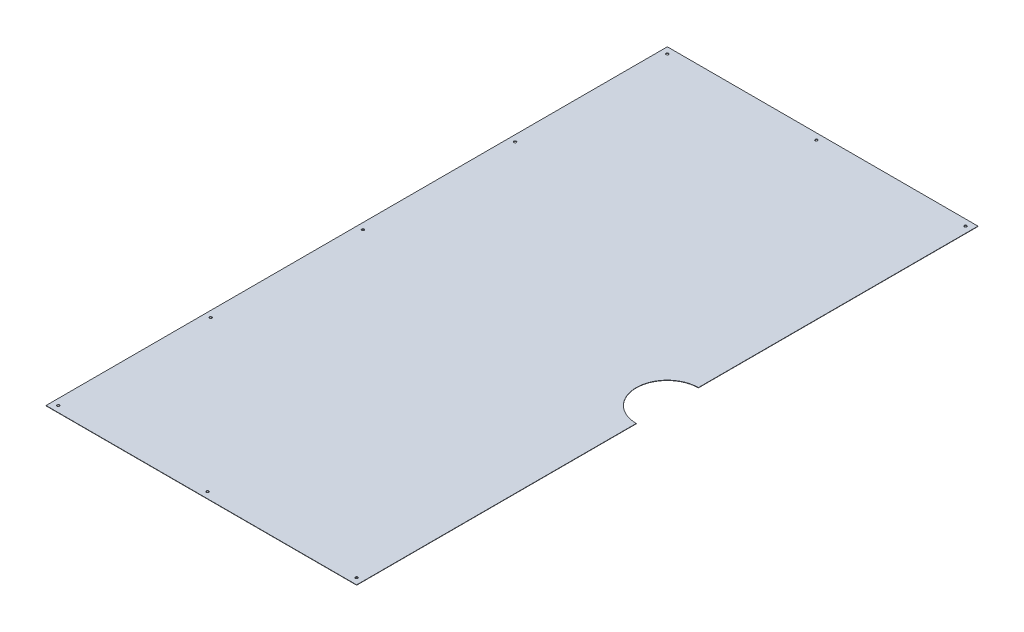
ISO-10303-21;
HEADER;
FILE_DESCRIPTION(('STEP AP214'),'2;1');
FILE_NAME('part.step','',(''),(''),'','','');
FILE_SCHEMA(('AUTOMOTIVE_DESIGN { 1 0 10303 214 1 1 1 1 }'));
ENDSEC;
DATA;
#1=APPLICATION_CONTEXT('core data for automotive mechanical design processes');
#2=APPLICATION_PROTOCOL_DEFINITION('international standard','automotive_design',2000,#1);
#3=PRODUCT_CONTEXT('',#1,'mechanical');
#4=PRODUCT('Part','Part','',(#3));
#5=PRODUCT_RELATED_PRODUCT_CATEGORY('part','',(#4));
#6=PRODUCT_DEFINITION_FORMATION('','',#4);
#7=PRODUCT_DEFINITION_CONTEXT('part definition',#1,'design');
#8=PRODUCT_DEFINITION('design','',#6,#7);
#9=PRODUCT_DEFINITION_SHAPE('','',#8);
#10=(LENGTH_UNIT() NAMED_UNIT(*) SI_UNIT(.MILLI.,.METRE.));
#11=(NAMED_UNIT(*) PLANE_ANGLE_UNIT() SI_UNIT($,.RADIAN.));
#12=(NAMED_UNIT(*) SI_UNIT($,.STERADIAN.) SOLID_ANGLE_UNIT());
#13=UNCERTAINTY_MEASURE_WITH_UNIT(LENGTH_MEASURE(1.E-05),#10,'distance_accuracy_value','');
#14=(GEOMETRIC_REPRESENTATION_CONTEXT(3) GLOBAL_UNCERTAINTY_ASSIGNED_CONTEXT((#13)) GLOBAL_UNIT_ASSIGNED_CONTEXT((#10,
#11,#12)) REPRESENTATION_CONTEXT('',''));
#15=CARTESIAN_POINT('',(0.,0.,0.));
#16=DIRECTION('',(0.,0.,1.));
#17=DIRECTION('',(1.,0.,0.));
#18=AXIS2_PLACEMENT_3D('',#15,#16,#17);
#19=CARTESIAN_POINT('',(500.,1.,0.));
#20=DIRECTION('',(0.,-1.,0.));
#21=DIRECTION('',(0.,0.,-1.));
#22=AXIS2_PLACEMENT_3D('',#19,#20,#21);
#23=CYLINDRICAL_SURFACE('',#22,100.);
#24=CARTESIAN_POINT('',(500.,0.,0.));
#25=DIRECTION('',(0.,1.,0.));
#26=DIRECTION('',(0.,0.,1.));
#27=AXIS2_PLACEMENT_3D('',#24,#25,#26);
#28=CIRCLE('',#27,100.);
#29=CARTESIAN_POINT('',(500.,0.,-100.));
#30=VERTEX_POINT('',#29);
#31=CARTESIAN_POINT('',(500.,0.,100.));
#32=VERTEX_POINT('',#31);
#33=EDGE_CURVE('E171',#30,#32,#28,.T.);
#34=ORIENTED_EDGE('',*,*,#33,.F.);
#35=DIRECTION('',(0.,-1.,0.));
#36=VECTOR('',#35,1.);
#37=CARTESIAN_POINT('',(500.,1.,-100.));
#38=LINE('',#37,#36);
#39=CARTESIAN_POINT('',(500.,1.,-100.));
#40=VERTEX_POINT('',#39);
#41=EDGE_CURVE('E93',#40,#30,#38,.T.);
#42=ORIENTED_EDGE('',*,*,#41,.F.);
#43=CARTESIAN_POINT('',(500.,1.,0.));
#44=DIRECTION('',(0.,1.,0.));
#45=DIRECTION('',(0.,0.,1.));
#46=AXIS2_PLACEMENT_3D('',#43,#44,#45);
#47=CIRCLE('',#46,100.);
#48=CARTESIAN_POINT('',(500.,1.,100.));
#49=VERTEX_POINT('',#48);
#50=EDGE_CURVE('E189',#40,#49,#47,.T.);
#51=ORIENTED_EDGE('',*,*,#50,.T.);
#52=DIRECTION('',(0.,-1.,0.));
#53=VECTOR('',#52,1.);
#54=CARTESIAN_POINT('',(500.,1.,100.));
#55=LINE('',#54,#53);
#56=EDGE_CURVE('E89',#49,#32,#55,.T.);
#57=ORIENTED_EDGE('',*,*,#56,.T.);
#58=EDGE_LOOP('',(#34,#42,#51,#57));
#59=FACE_BOUND('',#58,.T.);
#60=ADVANCED_FACE('F41',(#59),#23,.F.);
#61=CARTESIAN_POINT('',(500.,1.,-3.39234813079909E-13));
#62=DIRECTION('',(-1.,0.,0.));
#63=DIRECTION('',(0.,0.,1.));
#64=AXIS2_PLACEMENT_3D('',#61,#62,#63);
#65=PLANE('',#64);
#66=DIRECTION('',(0.,0.,-1.));
#67=VECTOR('',#66,1.);
#68=CARTESIAN_POINT('',(500.,0.,-3.39234813079909E-13));
#69=LINE('',#68,#67);
#70=CARTESIAN_POINT('',(499.999999999999,0.,-1000.));
#71=VERTEX_POINT('',#70);
#72=EDGE_CURVE('E174',#30,#71,#69,.T.);
#73=ORIENTED_EDGE('',*,*,#72,.T.);
#74=DIRECTION('',(0.,-1.,0.));
#75=VECTOR('',#74,1.);
#76=CARTESIAN_POINT('',(499.999999999999,1.,-1000.));
#77=LINE('',#76,#75);
#78=CARTESIAN_POINT('',(499.999999999999,1.,-1000.));
#79=VERTEX_POINT('',#78);
#80=EDGE_CURVE('E196',#79,#71,#77,.T.);
#81=ORIENTED_EDGE('',*,*,#80,.F.);
#82=DIRECTION('',(0.,0.,-1.));
#83=VECTOR('',#82,1.);
#84=CARTESIAN_POINT('',(500.,1.,-3.39234813079909E-13));
#85=LINE('',#84,#83);
#86=EDGE_CURVE('E129',#40,#79,#85,.T.);
#87=ORIENTED_EDGE('',*,*,#86,.F.);
#88=ORIENTED_EDGE('',*,*,#41,.T.);
#89=EDGE_LOOP('',(#73,#81,#87,#88));
#90=FACE_BOUND('',#89,.T.);
#91=ADVANCED_FACE('F254',(#90),#65,.F.);
#92=CARTESIAN_POINT('',(0.,1.,-1000.));
#93=DIRECTION('',(0.,0.,-1.));
#94=DIRECTION('',(-1.,0.,0.));
#95=AXIS2_PLACEMENT_3D('',#92,#93,#94);
#96=PLANE('',#95);
#97=DIRECTION('',(1.,0.,0.));
#98=VECTOR('',#97,1.);
#99=CARTESIAN_POINT('',(0.,0.,-1000.));
#100=LINE('',#99,#98);
#101=CARTESIAN_POINT('',(-500.,0.,-1000.));
#102=VERTEX_POINT('',#101);
#103=EDGE_CURVE('E178',#102,#71,#100,.T.);
#104=ORIENTED_EDGE('',*,*,#103,.F.);
#105=DIRECTION('',(0.,-1.,0.));
#106=VECTOR('',#105,1.);
#107=CARTESIAN_POINT('',(-500.,1.,-1000.));
#108=LINE('',#107,#106);
#109=CARTESIAN_POINT('',(-500.,1.,-1000.));
#110=VERTEX_POINT('',#109);
#111=EDGE_CURVE('E114',#110,#102,#108,.T.);
#112=ORIENTED_EDGE('',*,*,#111,.F.);
#113=DIRECTION('',(1.,0.,0.));
#114=VECTOR('',#113,1.);
#115=CARTESIAN_POINT('',(0.,1.,-1000.));
#116=LINE('',#115,#114);
#117=EDGE_CURVE('E125',#110,#79,#116,.T.);
#118=ORIENTED_EDGE('',*,*,#117,.T.);
#119=ORIENTED_EDGE('',*,*,#80,.T.);
#120=EDGE_LOOP('',(#104,#112,#118,#119));
#121=FACE_BOUND('',#120,.T.);
#122=ADVANCED_FACE('F259',(#121),#96,.T.);
#123=CARTESIAN_POINT('',(-500.,1.,0.));
#124=DIRECTION('',(-1.,0.,0.));
#125=DIRECTION('',(0.,0.,1.));
#126=AXIS2_PLACEMENT_3D('',#123,#124,#125);
#127=PLANE('',#126);
#128=DIRECTION('',(0.,0.,-1.));
#129=VECTOR('',#128,1.);
#130=CARTESIAN_POINT('',(-500.,0.,0.));
#131=LINE('',#130,#129);
#132=CARTESIAN_POINT('',(-500.,0.,1000.));
#133=VERTEX_POINT('',#132);
#134=EDGE_CURVE('E110',#133,#102,#131,.T.);
#135=ORIENTED_EDGE('',*,*,#134,.F.);
#136=DIRECTION('',(0.,-1.,0.));
#137=VECTOR('',#136,1.);
#138=CARTESIAN_POINT('',(-500.,1.,1000.));
#139=LINE('',#138,#137);
#140=CARTESIAN_POINT('',(-500.,1.,1000.));
#141=VERTEX_POINT('',#140);
#142=EDGE_CURVE('E104',#141,#133,#139,.T.);
#143=ORIENTED_EDGE('',*,*,#142,.F.);
#144=DIRECTION('',(0.,0.,-1.));
#145=VECTOR('',#144,1.);
#146=CARTESIAN_POINT('',(-500.,1.,0.));
#147=LINE('',#146,#145);
#148=EDGE_CURVE('E108',#141,#110,#147,.T.);
#149=ORIENTED_EDGE('',*,*,#148,.T.);
#150=ORIENTED_EDGE('',*,*,#111,.T.);
#151=EDGE_LOOP('',(#135,#143,#149,#150));
#152=FACE_BOUND('',#151,.T.);
#153=ADVANCED_FACE('F106',(#152),#127,.T.);
#154=CARTESIAN_POINT('',(2.22044604925031E-13,1.,1000.));
#155=DIRECTION('',(0.,0.,-1.));
#156=DIRECTION('',(-1.,0.,0.));
#157=AXIS2_PLACEMENT_3D('',#154,#155,#156);
#158=PLANE('',#157);
#159=DIRECTION('',(1.,0.,0.));
#160=VECTOR('',#159,1.);
#161=CARTESIAN_POINT('',(2.22044604925031E-13,0.,1000.));
#162=LINE('',#161,#160);
#163=CARTESIAN_POINT('',(500.,0.,1000.));
#164=VERTEX_POINT('',#163);
#165=EDGE_CURVE('E184',#133,#164,#162,.T.);
#166=ORIENTED_EDGE('',*,*,#165,.T.);
#167=DIRECTION('',(0.,-1.,0.));
#168=VECTOR('',#167,1.);
#169=CARTESIAN_POINT('',(500.,1.,1000.));
#170=LINE('',#169,#168);
#171=CARTESIAN_POINT('',(500.,1.,1000.));
#172=VERTEX_POINT('',#171);
#173=EDGE_CURVE('E115',#172,#164,#170,.T.);
#174=ORIENTED_EDGE('',*,*,#173,.F.);
#175=DIRECTION('',(1.,0.,0.));
#176=VECTOR('',#175,1.);
#177=CARTESIAN_POINT('',(2.22044604925031E-13,1.,1000.));
#178=LINE('',#177,#176);
#179=EDGE_CURVE('E118',#141,#172,#178,.T.);
#180=ORIENTED_EDGE('',*,*,#179,.F.);
#181=ORIENTED_EDGE('',*,*,#142,.T.);
#182=EDGE_LOOP('',(#166,#174,#180,#181));
#183=FACE_BOUND('',#182,.T.);
#184=ADVANCED_FACE('F119',(#183),#158,.F.);
#185=CARTESIAN_POINT('',(500.,1.,2.46716227694479E-13));
#186=DIRECTION('',(-1.,0.,0.));
#187=DIRECTION('',(0.,0.,1.));
#188=AXIS2_PLACEMENT_3D('',#185,#186,#187);
#189=PLANE('',#188);
#190=DIRECTION('',(0.,0.,-1.));
#191=VECTOR('',#190,1.);
#192=CARTESIAN_POINT('',(500.,0.,2.46716227694479E-13));
#193=LINE('',#192,#191);
#194=EDGE_CURVE('E82',#164,#32,#193,.T.);
#195=ORIENTED_EDGE('',*,*,#194,.T.);
#196=ORIENTED_EDGE('',*,*,#56,.F.);
#197=DIRECTION('',(0.,0.,-1.));
#198=VECTOR('',#197,1.);
#199=CARTESIAN_POINT('',(500.,1.,2.46716227694479E-13));
#200=LINE('',#199,#198);
#201=EDGE_CURVE('E59',#172,#49,#200,.T.);
#202=ORIENTED_EDGE('',*,*,#201,.F.);
#203=ORIENTED_EDGE('',*,*,#173,.T.);
#204=EDGE_LOOP('',(#195,#196,#202,#203));
#205=FACE_BOUND('',#204,.T.);
#206=ADVANCED_FACE('F308',(#205),#189,.F.);
#207=CARTESIAN_POINT('',(0.,1.,0.));
#208=DIRECTION('',(0.,1.,0.));
#209=DIRECTION('',(0.,0.,1.));
#210=AXIS2_PLACEMENT_3D('',#207,#208,#209);
#211=PLANE('',#210);
#212=CARTESIAN_POINT('',(0.,1.,-980.));
#213=DIRECTION('',(0.,1.,0.));
#214=DIRECTION('',(0.,0.,1.));
#215=AXIS2_PLACEMENT_3D('',#212,#213,#214);
#216=CIRCLE('',#215,4.00000000000023);
#217=CARTESIAN_POINT('',(0.,1.,-976.));
#218=VERTEX_POINT('',#217);
#219=EDGE_CURVE('E11',#218,#218,#216,.F.);
#220=ORIENTED_EDGE('',*,*,#219,.T.);
#221=EDGE_LOOP('',(#220));
#222=FACE_BOUND('',#221,.T.);
#223=CARTESIAN_POINT('',(480.,1.,-980.));
#224=DIRECTION('',(0.,1.,0.));
#225=DIRECTION('',(0.,0.,1.));
#226=AXIS2_PLACEMENT_3D('',#223,#224,#225);
#227=CIRCLE('',#226,4.00000000000023);
#228=CARTESIAN_POINT('',(480.,1.,-976.));
#229=VERTEX_POINT('',#228);
#230=EDGE_CURVE('E51',#229,#229,#227,.F.);
#231=ORIENTED_EDGE('',*,*,#230,.T.);
#232=EDGE_LOOP('',(#231));
#233=FACE_BOUND('',#232,.T.);
#234=CARTESIAN_POINT('',(-480.,1.,-980.));
#235=DIRECTION('',(0.,1.,0.));
#236=DIRECTION('',(0.,0.,1.));
#237=AXIS2_PLACEMENT_3D('',#234,#235,#236);
#238=CIRCLE('',#237,4.00000000000023);
#239=CARTESIAN_POINT('',(-480.,1.,-976.));
#240=VERTEX_POINT('',#239);
#241=EDGE_CURVE('E225',#240,#240,#238,.F.);
#242=ORIENTED_EDGE('',*,*,#241,.T.);
#243=EDGE_LOOP('',(#242));
#244=FACE_BOUND('',#243,.T.);
#245=CARTESIAN_POINT('',(-480.,1.,-490.));
#246=DIRECTION('',(0.,1.,0.));
#247=DIRECTION('',(0.,0.,1.));
#248=AXIS2_PLACEMENT_3D('',#245,#246,#247);
#249=CIRCLE('',#248,4.00000000000023);
#250=CARTESIAN_POINT('',(-480.,1.,-486.));
#251=VERTEX_POINT('',#250);
#252=EDGE_CURVE('E221',#251,#251,#249,.F.);
#253=ORIENTED_EDGE('',*,*,#252,.T.);
#254=EDGE_LOOP('',(#253));
#255=FACE_BOUND('',#254,.T.);
#256=CARTESIAN_POINT('',(-480.,1.,1.11022302462516E-13));
#257=DIRECTION('',(0.,1.,0.));
#258=DIRECTION('',(0.,0.,1.));
#259=AXIS2_PLACEMENT_3D('',#256,#257,#258);
#260=CIRCLE('',#259,4.00000000000023);
#261=CARTESIAN_POINT('',(-480.,1.,4.00000000000034));
#262=VERTEX_POINT('',#261);
#263=EDGE_CURVE('E217',#262,#262,#260,.F.);
#264=ORIENTED_EDGE('',*,*,#263,.T.);
#265=EDGE_LOOP('',(#264));
#266=FACE_BOUND('',#265,.T.);
#267=CARTESIAN_POINT('',(-480.,1.,490.));
#268=DIRECTION('',(0.,1.,0.));
#269=DIRECTION('',(0.,0.,1.));
#270=AXIS2_PLACEMENT_3D('',#267,#268,#269);
#271=CIRCLE('',#270,4.00000000000023);
#272=CARTESIAN_POINT('',(-480.,1.,494.));
#273=VERTEX_POINT('',#272);
#274=EDGE_CURVE('E213',#273,#273,#271,.F.);
#275=ORIENTED_EDGE('',*,*,#274,.T.);
#276=EDGE_LOOP('',(#275));
#277=FACE_BOUND('',#276,.T.);
#278=CARTESIAN_POINT('',(-480.,1.,980.));
#279=DIRECTION('',(0.,1.,0.));
#280=DIRECTION('',(0.,0.,1.));
#281=AXIS2_PLACEMENT_3D('',#278,#279,#280);
#282=CIRCLE('',#281,4.00000000000023);
#283=CARTESIAN_POINT('',(-480.,1.,984.));
#284=VERTEX_POINT('',#283);
#285=EDGE_CURVE('E209',#284,#284,#282,.F.);
#286=ORIENTED_EDGE('',*,*,#285,.T.);
#287=EDGE_LOOP('',(#286));
#288=FACE_BOUND('',#287,.T.);
#289=CARTESIAN_POINT('',(-2.22044604925031E-13,1.,980.));
#290=DIRECTION('',(0.,1.,0.));
#291=DIRECTION('',(0.,0.,1.));
#292=AXIS2_PLACEMENT_3D('',#289,#290,#291);
#293=CIRCLE('',#292,4.00000000000023);
#294=CARTESIAN_POINT('',(-2.22044604925031E-13,1.,984.));
#295=VERTEX_POINT('',#294);
#296=EDGE_CURVE('E205',#295,#295,#293,.F.);
#297=ORIENTED_EDGE('',*,*,#296,.T.);
#298=EDGE_LOOP('',(#297));
#299=FACE_BOUND('',#298,.T.);
#300=CARTESIAN_POINT('',(480.,1.,980.));
#301=DIRECTION('',(0.,1.,0.));
#302=DIRECTION('',(0.,0.,1.));
#303=AXIS2_PLACEMENT_3D('',#300,#301,#302);
#304=CIRCLE('',#303,4.00000000000023);
#305=CARTESIAN_POINT('',(480.,1.,984.));
#306=VERTEX_POINT('',#305);
#307=EDGE_CURVE('E201',#306,#306,#304,.F.);
#308=ORIENTED_EDGE('',*,*,#307,.T.);
#309=EDGE_LOOP('',(#308));
#310=FACE_BOUND('',#309,.T.);
#311=ORIENTED_EDGE('',*,*,#50,.F.);
#312=ORIENTED_EDGE('',*,*,#86,.T.);
#313=ORIENTED_EDGE('',*,*,#117,.F.);
#314=ORIENTED_EDGE('',*,*,#148,.F.);
#315=ORIENTED_EDGE('',*,*,#179,.T.);
#316=ORIENTED_EDGE('',*,*,#201,.T.);
#317=EDGE_LOOP('',(#311,#312,#313,#314,#315,#316));
#318=FACE_BOUND('',#317,.T.);
#319=ADVANCED_FACE('F123',(#222,#233,#244,#255,#266,#277,#288,#299,#310,#318),#211,.T.);
#320=CARTESIAN_POINT('',(0.,0.,0.));
#321=DIRECTION('',(0.,1.,0.));
#322=DIRECTION('',(0.,0.,1.));
#323=AXIS2_PLACEMENT_3D('',#320,#321,#322);
#324=PLANE('',#323);
#325=CARTESIAN_POINT('',(0.,0.,-980.));
#326=DIRECTION('',(0.,1.,0.));
#327=DIRECTION('',(0.,0.,1.));
#328=AXIS2_PLACEMENT_3D('',#325,#326,#327);
#329=CIRCLE('',#328,3.);
#330=CARTESIAN_POINT('',(0.,0.,-977.));
#331=VERTEX_POINT('',#330);
#332=EDGE_CURVE('E135',#331,#331,#329,.T.);
#333=ORIENTED_EDGE('',*,*,#332,.T.);
#334=EDGE_LOOP('',(#333));
#335=FACE_BOUND('',#334,.T.);
#336=CARTESIAN_POINT('',(-2.22044604925031E-13,0.,980.));
#337=DIRECTION('',(0.,1.,0.));
#338=DIRECTION('',(0.,0.,1.));
#339=AXIS2_PLACEMENT_3D('',#336,#337,#338);
#340=CIRCLE('',#339,3.);
#341=CARTESIAN_POINT('',(-2.22044604925031E-13,0.,983.));
#342=VERTEX_POINT('',#341);
#343=EDGE_CURVE('E139',#342,#342,#340,.T.);
#344=ORIENTED_EDGE('',*,*,#343,.T.);
#345=EDGE_LOOP('',(#344));
#346=FACE_BOUND('',#345,.T.);
#347=CARTESIAN_POINT('',(-480.,0.,490.));
#348=DIRECTION('',(0.,1.,0.));
#349=DIRECTION('',(0.,0.,1.));
#350=AXIS2_PLACEMENT_3D('',#347,#348,#349);
#351=CIRCLE('',#350,2.99999999999999);
#352=CARTESIAN_POINT('',(-480.,0.,493.));
#353=VERTEX_POINT('',#352);
#354=EDGE_CURVE('E143',#353,#353,#351,.T.);
#355=ORIENTED_EDGE('',*,*,#354,.T.);
#356=EDGE_LOOP('',(#355));
#357=FACE_BOUND('',#356,.T.);
#358=CARTESIAN_POINT('',(-480.,0.,1.11022302462516E-13));
#359=DIRECTION('',(0.,1.,0.));
#360=DIRECTION('',(0.,0.,1.));
#361=AXIS2_PLACEMENT_3D('',#358,#359,#360);
#362=CIRCLE('',#361,2.99999999999999);
#363=CARTESIAN_POINT('',(-480.,0.,3.00000000000011));
#364=VERTEX_POINT('',#363);
#365=EDGE_CURVE('E147',#364,#364,#362,.T.);
#366=ORIENTED_EDGE('',*,*,#365,.T.);
#367=EDGE_LOOP('',(#366));
#368=FACE_BOUND('',#367,.T.);
#369=CARTESIAN_POINT('',(-480.,0.,-980.));
#370=DIRECTION('',(0.,1.,0.));
#371=DIRECTION('',(0.,0.,1.));
#372=AXIS2_PLACEMENT_3D('',#369,#370,#371);
#373=CIRCLE('',#372,2.99999999999999);
#374=CARTESIAN_POINT('',(-480.,0.,-977.));
#375=VERTEX_POINT('',#374);
#376=EDGE_CURVE('E151',#375,#375,#373,.T.);
#377=ORIENTED_EDGE('',*,*,#376,.T.);
#378=EDGE_LOOP('',(#377));
#379=FACE_BOUND('',#378,.T.);
#380=CARTESIAN_POINT('',(480.,0.,-980.));
#381=DIRECTION('',(0.,1.,0.));
#382=DIRECTION('',(0.,0.,1.));
#383=AXIS2_PLACEMENT_3D('',#380,#381,#382);
#384=CIRCLE('',#383,2.99999999999999);
#385=CARTESIAN_POINT('',(480.,0.,-977.));
#386=VERTEX_POINT('',#385);
#387=EDGE_CURVE('E155',#386,#386,#384,.T.);
#388=ORIENTED_EDGE('',*,*,#387,.T.);
#389=EDGE_LOOP('',(#388));
#390=FACE_BOUND('',#389,.T.);
#391=CARTESIAN_POINT('',(480.,0.,980.));
#392=DIRECTION('',(0.,1.,0.));
#393=DIRECTION('',(0.,0.,1.));
#394=AXIS2_PLACEMENT_3D('',#391,#392,#393);
#395=CIRCLE('',#394,2.99999999999999);
#396=CARTESIAN_POINT('',(480.,0.,983.));
#397=VERTEX_POINT('',#396);
#398=EDGE_CURVE('E159',#397,#397,#395,.T.);
#399=ORIENTED_EDGE('',*,*,#398,.T.);
#400=EDGE_LOOP('',(#399));
#401=FACE_BOUND('',#400,.T.);
#402=CARTESIAN_POINT('',(-480.,0.,980.));
#403=DIRECTION('',(0.,1.,0.));
#404=DIRECTION('',(0.,0.,1.));
#405=AXIS2_PLACEMENT_3D('',#402,#403,#404);
#406=CIRCLE('',#405,2.99999999999999);
#407=CARTESIAN_POINT('',(-480.,0.,983.));
#408=VERTEX_POINT('',#407);
#409=EDGE_CURVE('E163',#408,#408,#406,.T.);
#410=ORIENTED_EDGE('',*,*,#409,.T.);
#411=EDGE_LOOP('',(#410));
#412=FACE_BOUND('',#411,.T.);
#413=CARTESIAN_POINT('',(-480.,0.,-490.));
#414=DIRECTION('',(0.,1.,0.));
#415=DIRECTION('',(0.,0.,1.));
#416=AXIS2_PLACEMENT_3D('',#413,#414,#415);
#417=CIRCLE('',#416,2.99999999999999);
#418=CARTESIAN_POINT('',(-480.,0.,-487.));
#419=VERTEX_POINT('',#418);
#420=EDGE_CURVE('E167',#419,#419,#417,.T.);
#421=ORIENTED_EDGE('',*,*,#420,.T.);
#422=EDGE_LOOP('',(#421));
#423=FACE_BOUND('',#422,.T.);
#424=ORIENTED_EDGE('',*,*,#33,.T.);
#425=ORIENTED_EDGE('',*,*,#194,.F.);
#426=ORIENTED_EDGE('',*,*,#165,.F.);
#427=ORIENTED_EDGE('',*,*,#134,.T.);
#428=ORIENTED_EDGE('',*,*,#103,.T.);
#429=ORIENTED_EDGE('',*,*,#72,.F.);
#430=EDGE_LOOP('',(#424,#425,#426,#427,#428,#429));
#431=FACE_BOUND('',#430,.T.);
#432=ADVANCED_FACE('F242',(#335,#346,#357,#368,#379,#390,#401,#412,#423,#431),#324,.F.);
#433=CARTESIAN_POINT('',(0.,0.,-980.));
#434=DIRECTION('',(0.,1.,0.));
#435=DIRECTION('',(0.,0.,1.));
#436=AXIS2_PLACEMENT_3D('',#433,#434,#435);
#437=CONICAL_SURFACE('',#436,3.,0.785398163397554);
#438=ORIENTED_EDGE('',*,*,#219,.F.);
#439=EDGE_LOOP('',(#438));
#440=FACE_BOUND('',#439,.T.);
#441=ORIENTED_EDGE('',*,*,#332,.F.);
#442=EDGE_LOOP('',(#441));
#443=FACE_BOUND('',#442,.T.);
#444=ADVANCED_FACE('F238',(#440,#443),#437,.F.);
#445=CARTESIAN_POINT('',(480.,0.,-980.));
#446=DIRECTION('',(0.,1.,0.));
#447=DIRECTION('',(0.,0.,1.));
#448=AXIS2_PLACEMENT_3D('',#445,#446,#447);
#449=CONICAL_SURFACE('',#448,2.99999999999999,0.785398163397554);
#450=ORIENTED_EDGE('',*,*,#230,.F.);
#451=EDGE_LOOP('',(#450));
#452=FACE_BOUND('',#451,.T.);
#453=ORIENTED_EDGE('',*,*,#387,.F.);
#454=EDGE_LOOP('',(#453));
#455=FACE_BOUND('',#454,.T.);
#456=ADVANCED_FACE('F234',(#452,#455),#449,.F.);
#457=CARTESIAN_POINT('',(-480.,0.,-980.));
#458=DIRECTION('',(0.,1.,0.));
#459=DIRECTION('',(0.,0.,1.));
#460=AXIS2_PLACEMENT_3D('',#457,#458,#459);
#461=CONICAL_SURFACE('',#460,2.99999999999999,0.785398163397554);
#462=ORIENTED_EDGE('',*,*,#241,.F.);
#463=EDGE_LOOP('',(#462));
#464=FACE_BOUND('',#463,.T.);
#465=ORIENTED_EDGE('',*,*,#376,.F.);
#466=EDGE_LOOP('',(#465));
#467=FACE_BOUND('',#466,.T.);
#468=ADVANCED_FACE('F237',(#464,#467),#461,.F.);
#469=CARTESIAN_POINT('',(-480.,0.,-490.));
#470=DIRECTION('',(0.,1.,0.));
#471=DIRECTION('',(0.,0.,1.));
#472=AXIS2_PLACEMENT_3D('',#469,#470,#471);
#473=CONICAL_SURFACE('',#472,2.99999999999999,0.785398163397554);
#474=ORIENTED_EDGE('',*,*,#252,.F.);
#475=EDGE_LOOP('',(#474));
#476=FACE_BOUND('',#475,.T.);
#477=ORIENTED_EDGE('',*,*,#420,.F.);
#478=EDGE_LOOP('',(#477));
#479=FACE_BOUND('',#478,.T.);
#480=ADVANCED_FACE('F269',(#476,#479),#473,.F.);
#481=CARTESIAN_POINT('',(-480.,0.,1.11022302462516E-13));
#482=DIRECTION('',(0.,1.,0.));
#483=DIRECTION('',(0.,0.,1.));
#484=AXIS2_PLACEMENT_3D('',#481,#482,#483);
#485=CONICAL_SURFACE('',#484,2.99999999999999,0.785398163397554);
#486=ORIENTED_EDGE('',*,*,#263,.F.);
#487=EDGE_LOOP('',(#486));
#488=FACE_BOUND('',#487,.T.);
#489=ORIENTED_EDGE('',*,*,#365,.F.);
#490=EDGE_LOOP('',(#489));
#491=FACE_BOUND('',#490,.T.);
#492=ADVANCED_FACE('F273',(#488,#491),#485,.F.);
#493=CARTESIAN_POINT('',(-480.,0.,490.));
#494=DIRECTION('',(0.,1.,0.));
#495=DIRECTION('',(0.,0.,1.));
#496=AXIS2_PLACEMENT_3D('',#493,#494,#495);
#497=CONICAL_SURFACE('',#496,2.99999999999999,0.785398163397554);
#498=ORIENTED_EDGE('',*,*,#274,.F.);
#499=EDGE_LOOP('',(#498));
#500=FACE_BOUND('',#499,.T.);
#501=ORIENTED_EDGE('',*,*,#354,.F.);
#502=EDGE_LOOP('',(#501));
#503=FACE_BOUND('',#502,.T.);
#504=ADVANCED_FACE('F277',(#500,#503),#497,.F.);
#505=CARTESIAN_POINT('',(-480.,0.,980.));
#506=DIRECTION('',(0.,1.,0.));
#507=DIRECTION('',(0.,0.,1.));
#508=AXIS2_PLACEMENT_3D('',#505,#506,#507);
#509=CONICAL_SURFACE('',#508,2.99999999999999,0.785398163397554);
#510=ORIENTED_EDGE('',*,*,#285,.F.);
#511=EDGE_LOOP('',(#510));
#512=FACE_BOUND('',#511,.T.);
#513=ORIENTED_EDGE('',*,*,#409,.F.);
#514=EDGE_LOOP('',(#513));
#515=FACE_BOUND('',#514,.T.);
#516=ADVANCED_FACE('F281',(#512,#515),#509,.F.);
#517=CARTESIAN_POINT('',(-2.22044604925031E-13,0.,980.));
#518=DIRECTION('',(0.,1.,0.));
#519=DIRECTION('',(0.,0.,1.));
#520=AXIS2_PLACEMENT_3D('',#517,#518,#519);
#521=CONICAL_SURFACE('',#520,3.,0.785398163397554);
#522=ORIENTED_EDGE('',*,*,#296,.F.);
#523=EDGE_LOOP('',(#522));
#524=FACE_BOUND('',#523,.T.);
#525=ORIENTED_EDGE('',*,*,#343,.F.);
#526=EDGE_LOOP('',(#525));
#527=FACE_BOUND('',#526,.T.);
#528=ADVANCED_FACE('F284',(#524,#527),#521,.F.);
#529=CARTESIAN_POINT('',(480.,0.,980.));
#530=DIRECTION('',(0.,1.,0.));
#531=DIRECTION('',(0.,0.,1.));
#532=AXIS2_PLACEMENT_3D('',#529,#530,#531);
#533=CONICAL_SURFACE('',#532,2.99999999999999,0.785398163397554);
#534=ORIENTED_EDGE('',*,*,#307,.F.);
#535=EDGE_LOOP('',(#534));
#536=FACE_BOUND('',#535,.T.);
#537=ORIENTED_EDGE('',*,*,#398,.F.);
#538=EDGE_LOOP('',(#537));
#539=FACE_BOUND('',#538,.T.);
#540=ADVANCED_FACE('F43',(#536,#539),#533,.F.);
#541=CLOSED_SHELL('',(#60,#91,#122,#153,#184,#206,#319,#432,#444,#456,#468,#480,#492,#504,#516,
#528,#540));
#542=MANIFOLD_SOLID_BREP('B2',#541);
#543=ADVANCED_BREP_SHAPE_REPRESENTATION('',(#18,#542),#14);
#544=SHAPE_DEFINITION_REPRESENTATION(#9,#543);
ENDSEC;
END-ISO-10303-21;
